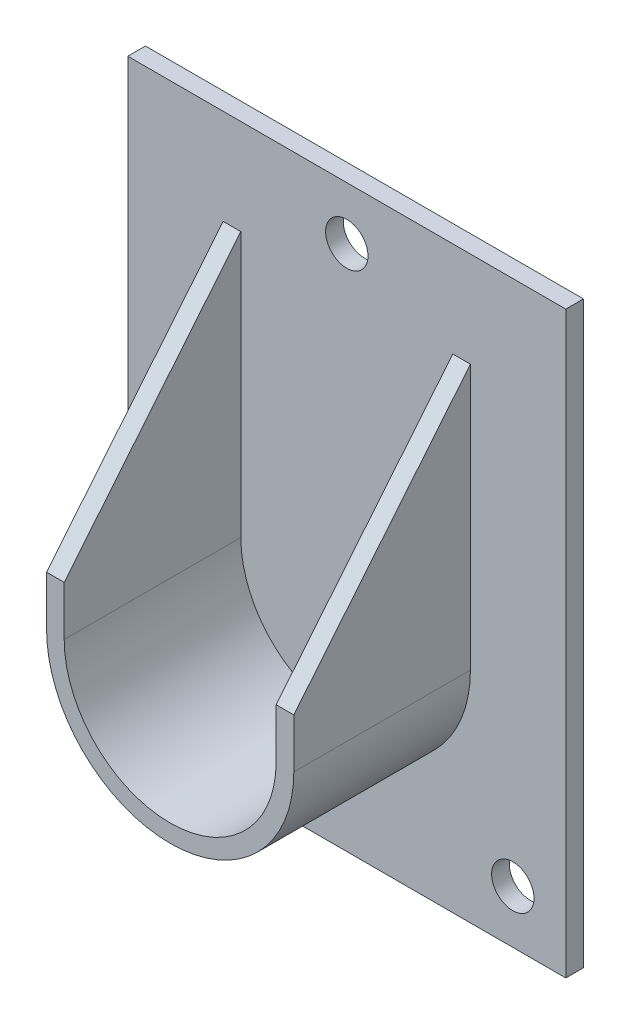
ISO-10303-21;
HEADER;
FILE_DESCRIPTION(('STEP AP214'),'2;1');
FILE_NAME('part.step','',(''),(''),'','','');
FILE_SCHEMA(('AUTOMOTIVE_DESIGN { 1 0 10303 214 1 1 1 1 }'));
ENDSEC;
DATA;
#1=APPLICATION_CONTEXT('core data for automotive mechanical design processes');
#2=APPLICATION_PROTOCOL_DEFINITION('international standard','automotive_design',2000,#1);
#3=PRODUCT_CONTEXT('',#1,'mechanical');
#4=PRODUCT('Part','Part','',(#3));
#5=PRODUCT_RELATED_PRODUCT_CATEGORY('part','',(#4));
#6=PRODUCT_DEFINITION_FORMATION('','',#4);
#7=PRODUCT_DEFINITION_CONTEXT('part definition',#1,'design');
#8=PRODUCT_DEFINITION('design','',#6,#7);
#9=PRODUCT_DEFINITION_SHAPE('','',#8);
#10=(LENGTH_UNIT() NAMED_UNIT(*) SI_UNIT(.MILLI.,.METRE.));
#11=(NAMED_UNIT(*) PLANE_ANGLE_UNIT() SI_UNIT($,.RADIAN.));
#12=(NAMED_UNIT(*) SI_UNIT($,.STERADIAN.) SOLID_ANGLE_UNIT());
#13=UNCERTAINTY_MEASURE_WITH_UNIT(LENGTH_MEASURE(1.E-05),#10,'distance_accuracy_value','');
#14=(GEOMETRIC_REPRESENTATION_CONTEXT(3) GLOBAL_UNCERTAINTY_ASSIGNED_CONTEXT((#13)) GLOBAL_UNIT_ASSIGNED_CONTEXT((#10,
#11,#12)) REPRESENTATION_CONTEXT('',''));
#15=CARTESIAN_POINT('',(0.,0.,0.));
#16=DIRECTION('',(0.,0.,1.));
#17=DIRECTION('',(1.,0.,0.));
#18=AXIS2_PLACEMENT_3D('',#15,#16,#17);
#19=CARTESIAN_POINT('',(30.,0.,55.));
#20=DIRECTION('',(1.,0.,0.));
#21=DIRECTION('',(0.,0.,-1.));
#22=AXIS2_PLACEMENT_3D('',#19,#20,#21);
#23=PLANE('',#22);
#24=DIRECTION('',(0.,-0.773392104960213,0.63392795488542));
#25=VECTOR('',#24,1.);
#26=CARTESIAN_POINT('',(30.,5.62610512779297,61.8638482559074));
#27=LINE('',#26,#25);
#28=CARTESIAN_POINT('',(30.,75.,5.));
#29=VERTEX_POINT('',#28);
#30=CARTESIAN_POINT('',(30.,14.,55.));
#31=VERTEX_POINT('',#30);
#32=EDGE_CURVE('E300',#29,#31,#27,.T.);
#33=ORIENTED_EDGE('',*,*,#32,.F.);
#34=DIRECTION('',(0.,-1.,0.));
#35=VECTOR('',#34,1.);
#36=CARTESIAN_POINT('',(30.,75.,5.));
#37=LINE('',#36,#35);
#38=CARTESIAN_POINT('',(30.,0.,5.));
#39=VERTEX_POINT('',#38);
#40=EDGE_CURVE('E323',#29,#39,#37,.T.);
#41=ORIENTED_EDGE('',*,*,#40,.T.);
#42=DIRECTION('',(0.,0.,-1.));
#43=VECTOR('',#42,1.);
#44=CARTESIAN_POINT('',(30.,0.,55.));
#45=LINE('',#44,#43);
#46=CARTESIAN_POINT('',(30.,0.,55.));
#47=VERTEX_POINT('',#46);
#48=EDGE_CURVE('E309',#47,#39,#45,.T.);
#49=ORIENTED_EDGE('',*,*,#48,.F.);
#50=DIRECTION('',(0.,-1.,0.));
#51=VECTOR('',#50,1.);
#52=CARTESIAN_POINT('',(30.,0.,55.));
#53=LINE('',#52,#51);
#54=EDGE_CURVE('E306',#31,#47,#53,.T.);
#55=ORIENTED_EDGE('',*,*,#54,.F.);
#56=EDGE_LOOP('',(#33,#41,#49,#55));
#57=FACE_BOUND('',#56,.T.);
#58=ADVANCED_FACE('F39',(#57),#23,.F.);
#59=CARTESIAN_POINT('',(35.,0.,55.));
#60=DIRECTION('',(1.,0.,0.));
#61=DIRECTION('',(0.,1.,0.));
#62=AXIS2_PLACEMENT_3D('',#59,#60,#61);
#63=PLANE('',#62);
#64=DIRECTION('',(0.,1.,0.));
#65=VECTOR('',#64,1.);
#66=CARTESIAN_POINT('',(35.,75.,5.));
#67=LINE('',#66,#65);
#68=CARTESIAN_POINT('',(35.,0.,5.));
#69=VERTEX_POINT('',#68);
#70=CARTESIAN_POINT('',(35.,75.,5.));
#71=VERTEX_POINT('',#70);
#72=EDGE_CURVE('E147',#69,#71,#67,.T.);
#73=ORIENTED_EDGE('',*,*,#72,.T.);
#74=DIRECTION('',(0.,-0.773392104960213,0.63392795488542));
#75=VECTOR('',#74,1.);
#76=CARTESIAN_POINT('',(35.,5.62610512779298,61.8638482559074));
#77=LINE('',#76,#75);
#78=CARTESIAN_POINT('',(35.,14.,55.));
#79=VERTEX_POINT('',#78);
#80=EDGE_CURVE('E142',#71,#79,#77,.T.);
#81=ORIENTED_EDGE('',*,*,#80,.T.);
#82=DIRECTION('',(0.,-1.,0.));
#83=VECTOR('',#82,1.);
#84=CARTESIAN_POINT('',(35.,0.,55.));
#85=LINE('',#84,#83);
#86=CARTESIAN_POINT('',(35.,0.,55.));
#87=VERTEX_POINT('',#86);
#88=EDGE_CURVE('E308',#79,#87,#85,.T.);
#89=ORIENTED_EDGE('',*,*,#88,.T.);
#90=DIRECTION('',(0.,0.,-1.));
#91=VECTOR('',#90,1.);
#92=CARTESIAN_POINT('',(35.,0.,55.));
#93=LINE('',#92,#91);
#94=EDGE_CURVE('E311',#87,#69,#93,.T.);
#95=ORIENTED_EDGE('',*,*,#94,.T.);
#96=EDGE_LOOP('',(#73,#81,#89,#95));
#97=FACE_BOUND('',#96,.T.);
#98=ADVANCED_FACE('F252',(#97),#63,.T.);
#99=CARTESIAN_POINT('',(-35.,0.,55.));
#100=DIRECTION('',(1.,0.,0.));
#101=DIRECTION('',(0.,1.,0.));
#102=AXIS2_PLACEMENT_3D('',#99,#100,#101);
#103=PLANE('',#102);
#104=DIRECTION('',(0.,-0.773392104960213,0.63392795488542));
#105=VECTOR('',#104,1.);
#106=CARTESIAN_POINT('',(-35.,5.62610512779296,61.8638482559074));
#107=LINE('',#106,#105);
#108=CARTESIAN_POINT('',(-35.,75.,5.));
#109=VERTEX_POINT('',#108);
#110=CARTESIAN_POINT('',(-35.,14.,55.));
#111=VERTEX_POINT('',#110);
#112=EDGE_CURVE('E126',#109,#111,#107,.T.);
#113=ORIENTED_EDGE('',*,*,#112,.F.);
#114=DIRECTION('',(0.,-1.,0.));
#115=VECTOR('',#114,1.);
#116=CARTESIAN_POINT('',(-35.,75.,5.));
#117=LINE('',#116,#115);
#118=CARTESIAN_POINT('',(-35.,0.,5.));
#119=VERTEX_POINT('',#118);
#120=EDGE_CURVE('E135',#109,#119,#117,.T.);
#121=ORIENTED_EDGE('',*,*,#120,.T.);
#122=DIRECTION('',(0.,0.,-1.));
#123=VECTOR('',#122,1.);
#124=CARTESIAN_POINT('',(-35.,0.,55.));
#125=LINE('',#124,#123);
#126=CARTESIAN_POINT('',(-35.,0.,55.));
#127=VERTEX_POINT('',#126);
#128=EDGE_CURVE('E316',#127,#119,#125,.T.);
#129=ORIENTED_EDGE('',*,*,#128,.F.);
#130=DIRECTION('',(0.,-1.,0.));
#131=VECTOR('',#130,1.);
#132=CARTESIAN_POINT('',(-35.,0.,55.));
#133=LINE('',#132,#131);
#134=EDGE_CURVE('E143',#111,#127,#133,.T.);
#135=ORIENTED_EDGE('',*,*,#134,.F.);
#136=EDGE_LOOP('',(#113,#121,#129,#135));
#137=FACE_BOUND('',#136,.T.);
#138=ADVANCED_FACE('F139',(#137),#103,.F.);
#139=CARTESIAN_POINT('',(-30.,0.,55.));
#140=DIRECTION('',(1.,0.,0.));
#141=DIRECTION('',(0.,0.,-1.));
#142=AXIS2_PLACEMENT_3D('',#139,#140,#141);
#143=PLANE('',#142);
#144=DIRECTION('',(0.,1.,0.));
#145=VECTOR('',#144,1.);
#146=CARTESIAN_POINT('',(-30.,75.,5.));
#147=LINE('',#146,#145);
#148=CARTESIAN_POINT('',(-30.,0.,5.));
#149=VERTEX_POINT('',#148);
#150=CARTESIAN_POINT('',(-30.,75.,5.));
#151=VERTEX_POINT('',#150);
#152=EDGE_CURVE('E134',#149,#151,#147,.T.);
#153=ORIENTED_EDGE('',*,*,#152,.T.);
#154=DIRECTION('',(0.,-0.773392104960213,0.63392795488542));
#155=VECTOR('',#154,1.);
#156=CARTESIAN_POINT('',(-30.,5.62610512779296,61.8638482559074));
#157=LINE('',#156,#155);
#158=CARTESIAN_POINT('',(-30.,14.,55.));
#159=VERTEX_POINT('',#158);
#160=EDGE_CURVE('E11',#151,#159,#157,.T.);
#161=ORIENTED_EDGE('',*,*,#160,.T.);
#162=DIRECTION('',(0.,-1.,0.));
#163=VECTOR('',#162,1.);
#164=CARTESIAN_POINT('',(-30.,0.,55.));
#165=LINE('',#164,#163);
#166=CARTESIAN_POINT('',(-30.,0.,55.));
#167=VERTEX_POINT('',#166);
#168=EDGE_CURVE('E291',#159,#167,#165,.T.);
#169=ORIENTED_EDGE('',*,*,#168,.T.);
#170=DIRECTION('',(0.,0.,-1.));
#171=VECTOR('',#170,1.);
#172=CARTESIAN_POINT('',(-30.,0.,55.));
#173=LINE('',#172,#171);
#174=EDGE_CURVE('E318',#167,#149,#173,.T.);
#175=ORIENTED_EDGE('',*,*,#174,.T.);
#176=EDGE_LOOP('',(#153,#161,#169,#175));
#177=FACE_BOUND('',#176,.T.);
#178=ADVANCED_FACE('F225',(#177),#143,.T.);
#179=CARTESIAN_POINT('',(0.,0.,5.));
#180=DIRECTION('',(0.,0.,1.));
#181=DIRECTION('',(1.,0.,0.));
#182=AXIS2_PLACEMENT_3D('',#179,#180,#181);
#183=PLANE('',#182);
#184=DIRECTION('',(-1.,0.,0.));
#185=VECTOR('',#184,1.);
#186=CARTESIAN_POINT('',(35.,75.,5.));
#187=LINE('',#186,#185);
#188=EDGE_CURVE('E321',#71,#29,#187,.T.);
#189=ORIENTED_EDGE('',*,*,#188,.F.);
#190=ORIENTED_EDGE('',*,*,#72,.F.);
#191=CARTESIAN_POINT('',(0.,0.,5.));
#192=DIRECTION('',(0.,0.,1.));
#193=DIRECTION('',(1.,0.,0.));
#194=AXIS2_PLACEMENT_3D('',#191,#192,#193);
#195=CIRCLE('',#194,35.);
#196=EDGE_CURVE('E146',#119,#69,#195,.T.);
#197=ORIENTED_EDGE('',*,*,#196,.F.);
#198=ORIENTED_EDGE('',*,*,#120,.F.);
#199=DIRECTION('',(-1.,0.,0.));
#200=VECTOR('',#199,1.);
#201=CARTESIAN_POINT('',(-30.,75.,5.));
#202=LINE('',#201,#200);
#203=EDGE_CURVE('E123',#151,#109,#202,.T.);
#204=ORIENTED_EDGE('',*,*,#203,.F.);
#205=ORIENTED_EDGE('',*,*,#152,.F.);
#206=CARTESIAN_POINT('',(0.,0.,5.));
#207=DIRECTION('',(0.,0.,-1.));
#208=DIRECTION('',(1.,0.,0.));
#209=AXIS2_PLACEMENT_3D('',#206,#207,#208);
#210=CIRCLE('',#209,30.);
#211=EDGE_CURVE('E326',#39,#149,#210,.T.);
#212=ORIENTED_EDGE('',*,*,#211,.F.);
#213=ORIENTED_EDGE('',*,*,#40,.F.);
#214=EDGE_LOOP('',(#189,#190,#197,#198,#204,#205,#212,#213));
#215=FACE_BOUND('',#214,.T.);
#216=DIRECTION('',(0.,1.,0.));
#217=VECTOR('',#216,1.);
#218=CARTESIAN_POINT('',(62.,102.,5.));
#219=LINE('',#218,#217);
#220=CARTESIAN_POINT('',(62.,-62.,5.));
#221=VERTEX_POINT('',#220);
#222=CARTESIAN_POINT('',(62.,102.,5.));
#223=VERTEX_POINT('',#222);
#224=EDGE_CURVE('E178',#221,#223,#219,.T.);
#225=ORIENTED_EDGE('',*,*,#224,.T.);
#226=DIRECTION('',(-1.,0.,0.));
#227=VECTOR('',#226,1.);
#228=CARTESIAN_POINT('',(-62.,102.,5.));
#229=LINE('',#228,#227);
#230=CARTESIAN_POINT('',(-62.,102.,5.));
#231=VERTEX_POINT('',#230);
#232=EDGE_CURVE('E185',#223,#231,#229,.T.);
#233=ORIENTED_EDGE('',*,*,#232,.T.);
#234=DIRECTION('',(0.,-1.,0.));
#235=VECTOR('',#234,1.);
#236=CARTESIAN_POINT('',(-62.,102.,5.));
#237=LINE('',#236,#235);
#238=CARTESIAN_POINT('',(-62.,-62.,5.));
#239=VERTEX_POINT('',#238);
#240=EDGE_CURVE('E173',#231,#239,#237,.T.);
#241=ORIENTED_EDGE('',*,*,#240,.T.);
#242=DIRECTION('',(1.,0.,0.));
#243=VECTOR('',#242,1.);
#244=CARTESIAN_POINT('',(-62.,-62.,5.));
#245=LINE('',#244,#243);
#246=EDGE_CURVE('E180',#239,#221,#245,.T.);
#247=ORIENTED_EDGE('',*,*,#246,.T.);
#248=EDGE_LOOP('',(#225,#233,#241,#247));
#249=FACE_BOUND('',#248,.T.);
#250=CARTESIAN_POINT('',(0.,87.,5.));
#251=DIRECTION('',(0.,0.,1.));
#252=DIRECTION('',(1.,0.,0.));
#253=AXIS2_PLACEMENT_3D('',#250,#251,#252);
#254=CIRCLE('',#253,6.00000000000001);
#255=CARTESIAN_POINT('',(6.00000000000001,87.,5.));
#256=VERTEX_POINT('',#255);
#257=EDGE_CURVE('E166',#256,#256,#254,.T.);
#258=ORIENTED_EDGE('',*,*,#257,.F.);
#259=EDGE_LOOP('',(#258));
#260=FACE_BOUND('',#259,.T.);
#261=CARTESIAN_POINT('',(-47.,-47.,5.));
#262=DIRECTION('',(0.,0.,1.));
#263=DIRECTION('',(-1.,0.,0.));
#264=AXIS2_PLACEMENT_3D('',#261,#262,#263);
#265=CIRCLE('',#264,6.);
#266=CARTESIAN_POINT('',(-53.,-47.,5.));
#267=VERTEX_POINT('',#266);
#268=EDGE_CURVE('E160',#267,#267,#265,.T.);
#269=ORIENTED_EDGE('',*,*,#268,.F.);
#270=EDGE_LOOP('',(#269));
#271=FACE_BOUND('',#270,.T.);
#272=CARTESIAN_POINT('',(47.,-47.,5.));
#273=DIRECTION('',(0.,0.,1.));
#274=DIRECTION('',(1.,0.,0.));
#275=AXIS2_PLACEMENT_3D('',#272,#273,#274);
#276=CIRCLE('',#275,6.);
#277=CARTESIAN_POINT('',(53.,-47.,5.));
#278=VERTEX_POINT('',#277);
#279=EDGE_CURVE('E162',#278,#278,#276,.T.);
#280=ORIENTED_EDGE('',*,*,#279,.F.);
#281=EDGE_LOOP('',(#280));
#282=FACE_BOUND('',#281,.T.);
#283=ADVANCED_FACE('F144',(#215,#249,#260,#271,#282),#183,.T.);
#284=CARTESIAN_POINT('',(0.,0.,0.));
#285=DIRECTION('',(0.,0.,1.));
#286=DIRECTION('',(1.,0.,0.));
#287=AXIS2_PLACEMENT_3D('',#284,#285,#286);
#288=PLANE('',#287);
#289=CARTESIAN_POINT('',(-47.,-47.,0.));
#290=DIRECTION('',(0.,0.,1.));
#291=DIRECTION('',(-1.,0.,0.));
#292=AXIS2_PLACEMENT_3D('',#289,#290,#291);
#293=CIRCLE('',#292,6.);
#294=CARTESIAN_POINT('',(-53.,-47.,0.));
#295=VERTEX_POINT('',#294);
#296=EDGE_CURVE('E156',#295,#295,#293,.T.);
#297=ORIENTED_EDGE('',*,*,#296,.T.);
#298=EDGE_LOOP('',(#297));
#299=FACE_BOUND('',#298,.T.);
#300=CARTESIAN_POINT('',(47.,-47.,0.));
#301=DIRECTION('',(0.,0.,1.));
#302=DIRECTION('',(1.,0.,0.));
#303=AXIS2_PLACEMENT_3D('',#300,#301,#302);
#304=CIRCLE('',#303,6.);
#305=CARTESIAN_POINT('',(53.,-47.,0.));
#306=VERTEX_POINT('',#305);
#307=EDGE_CURVE('E159',#306,#306,#304,.T.);
#308=ORIENTED_EDGE('',*,*,#307,.T.);
#309=EDGE_LOOP('',(#308));
#310=FACE_BOUND('',#309,.T.);
#311=CARTESIAN_POINT('',(0.,87.,0.));
#312=DIRECTION('',(0.,0.,1.));
#313=DIRECTION('',(1.,0.,0.));
#314=AXIS2_PLACEMENT_3D('',#311,#312,#313);
#315=CIRCLE('',#314,6.00000000000001);
#316=CARTESIAN_POINT('',(6.00000000000001,87.,0.));
#317=VERTEX_POINT('',#316);
#318=EDGE_CURVE('E167',#317,#317,#315,.T.);
#319=ORIENTED_EDGE('',*,*,#318,.T.);
#320=EDGE_LOOP('',(#319));
#321=FACE_BOUND('',#320,.T.);
#322=DIRECTION('',(0.,-1.,0.));
#323=VECTOR('',#322,1.);
#324=CARTESIAN_POINT('',(-62.,102.,0.));
#325=LINE('',#324,#323);
#326=CARTESIAN_POINT('',(-62.,102.,0.));
#327=VERTEX_POINT('',#326);
#328=CARTESIAN_POINT('',(-62.,-62.,0.));
#329=VERTEX_POINT('',#328);
#330=EDGE_CURVE('E175',#327,#329,#325,.T.);
#331=ORIENTED_EDGE('',*,*,#330,.F.);
#332=DIRECTION('',(-1.,0.,0.));
#333=VECTOR('',#332,1.);
#334=CARTESIAN_POINT('',(-62.,102.,0.));
#335=LINE('',#334,#333);
#336=CARTESIAN_POINT('',(62.,102.,0.));
#337=VERTEX_POINT('',#336);
#338=EDGE_CURVE('E179',#337,#327,#335,.T.);
#339=ORIENTED_EDGE('',*,*,#338,.F.);
#340=DIRECTION('',(0.,1.,0.));
#341=VECTOR('',#340,1.);
#342=CARTESIAN_POINT('',(62.,102.,0.));
#343=LINE('',#342,#341);
#344=CARTESIAN_POINT('',(62.,-62.,0.));
#345=VERTEX_POINT('',#344);
#346=EDGE_CURVE('E186',#345,#337,#343,.T.);
#347=ORIENTED_EDGE('',*,*,#346,.F.);
#348=DIRECTION('',(1.,0.,0.));
#349=VECTOR('',#348,1.);
#350=CARTESIAN_POINT('',(-62.,-62.,0.));
#351=LINE('',#350,#349);
#352=EDGE_CURVE('E190',#329,#345,#351,.T.);
#353=ORIENTED_EDGE('',*,*,#352,.F.);
#354=EDGE_LOOP('',(#331,#339,#347,#353));
#355=FACE_BOUND('',#354,.T.);
#356=ADVANCED_FACE('F211',(#299,#310,#321,#355),#288,.F.);
#357=CARTESIAN_POINT('',(-62.,102.,5.));
#358=DIRECTION('',(1.,0.,0.));
#359=DIRECTION('',(0.,1.,0.));
#360=AXIS2_PLACEMENT_3D('',#357,#358,#359);
#361=PLANE('',#360);
#362=ORIENTED_EDGE('',*,*,#330,.T.);
#363=DIRECTION('',(0.,0.,-1.));
#364=VECTOR('',#363,1.);
#365=CARTESIAN_POINT('',(-62.,-62.,5.));
#366=LINE('',#365,#364);
#367=EDGE_CURVE('E50',#239,#329,#366,.T.);
#368=ORIENTED_EDGE('',*,*,#367,.F.);
#369=ORIENTED_EDGE('',*,*,#240,.F.);
#370=DIRECTION('',(0.,0.,-1.));
#371=VECTOR('',#370,1.);
#372=CARTESIAN_POINT('',(-62.,102.,5.));
#373=LINE('',#372,#371);
#374=EDGE_CURVE('E184',#231,#327,#373,.T.);
#375=ORIENTED_EDGE('',*,*,#374,.T.);
#376=EDGE_LOOP('',(#362,#368,#369,#375));
#377=FACE_BOUND('',#376,.T.);
#378=ADVANCED_FACE('F41',(#377),#361,.F.);
#379=CARTESIAN_POINT('',(-62.,-62.,5.));
#380=DIRECTION('',(0.,1.,0.));
#381=DIRECTION('',(-1.,0.,0.));
#382=AXIS2_PLACEMENT_3D('',#379,#380,#381);
#383=PLANE('',#382);
#384=ORIENTED_EDGE('',*,*,#352,.T.);
#385=DIRECTION('',(0.,0.,-1.));
#386=VECTOR('',#385,1.);
#387=CARTESIAN_POINT('',(62.,-62.,5.));
#388=LINE('',#387,#386);
#389=EDGE_CURVE('E197',#221,#345,#388,.T.);
#390=ORIENTED_EDGE('',*,*,#389,.F.);
#391=ORIENTED_EDGE('',*,*,#246,.F.);
#392=ORIENTED_EDGE('',*,*,#367,.T.);
#393=EDGE_LOOP('',(#384,#390,#391,#392));
#394=FACE_BOUND('',#393,.T.);
#395=ADVANCED_FACE('F201',(#394),#383,.F.);
#396=CARTESIAN_POINT('',(62.,102.,5.));
#397=DIRECTION('',(-1.,0.,0.));
#398=DIRECTION('',(0.,-1.,0.));
#399=AXIS2_PLACEMENT_3D('',#396,#397,#398);
#400=PLANE('',#399);
#401=ORIENTED_EDGE('',*,*,#346,.T.);
#402=DIRECTION('',(0.,0.,-1.));
#403=VECTOR('',#402,1.);
#404=CARTESIAN_POINT('',(62.,102.,5.));
#405=LINE('',#404,#403);
#406=EDGE_CURVE('E191',#223,#337,#405,.T.);
#407=ORIENTED_EDGE('',*,*,#406,.F.);
#408=ORIENTED_EDGE('',*,*,#224,.F.);
#409=ORIENTED_EDGE('',*,*,#389,.T.);
#410=EDGE_LOOP('',(#401,#407,#408,#409));
#411=FACE_BOUND('',#410,.T.);
#412=ADVANCED_FACE('F214',(#411),#400,.F.);
#413=CARTESIAN_POINT('',(-62.,102.,5.));
#414=DIRECTION('',(0.,-1.,0.));
#415=DIRECTION('',(1.,0.,0.));
#416=AXIS2_PLACEMENT_3D('',#413,#414,#415);
#417=PLANE('',#416);
#418=ORIENTED_EDGE('',*,*,#338,.T.);
#419=ORIENTED_EDGE('',*,*,#374,.F.);
#420=ORIENTED_EDGE('',*,*,#232,.F.);
#421=ORIENTED_EDGE('',*,*,#406,.T.);
#422=EDGE_LOOP('',(#418,#419,#420,#421));
#423=FACE_BOUND('',#422,.T.);
#424=ADVANCED_FACE('F218',(#423),#417,.F.);
#425=CARTESIAN_POINT('',(0.,87.,5.));
#426=DIRECTION('',(0.,0.,-1.));
#427=DIRECTION('',(-1.,0.,0.));
#428=AXIS2_PLACEMENT_3D('',#425,#426,#427);
#429=CYLINDRICAL_SURFACE('',#428,6.00000000000001);
#430=ORIENTED_EDGE('',*,*,#257,.T.);
#431=EDGE_LOOP('',(#430));
#432=FACE_BOUND('',#431,.T.);
#433=ORIENTED_EDGE('',*,*,#318,.F.);
#434=EDGE_LOOP('',(#433));
#435=FACE_BOUND('',#434,.T.);
#436=ADVANCED_FACE('F231',(#432,#435),#429,.F.);
#437=CARTESIAN_POINT('',(47.,-47.,5.));
#438=DIRECTION('',(0.,0.,-1.));
#439=DIRECTION('',(-1.,0.,0.));
#440=AXIS2_PLACEMENT_3D('',#437,#438,#439);
#441=CYLINDRICAL_SURFACE('',#440,6.);
#442=ORIENTED_EDGE('',*,*,#279,.T.);
#443=EDGE_LOOP('',(#442));
#444=FACE_BOUND('',#443,.T.);
#445=ORIENTED_EDGE('',*,*,#307,.F.);
#446=EDGE_LOOP('',(#445));
#447=FACE_BOUND('',#446,.T.);
#448=ADVANCED_FACE('F228',(#444,#447),#441,.F.);
#449=CARTESIAN_POINT('',(-47.,-47.,5.));
#450=DIRECTION('',(0.,0.,-1.));
#451=DIRECTION('',(-1.,0.,0.));
#452=AXIS2_PLACEMENT_3D('',#449,#450,#451);
#453=CYLINDRICAL_SURFACE('',#452,6.);
#454=ORIENTED_EDGE('',*,*,#268,.T.);
#455=EDGE_LOOP('',(#454));
#456=FACE_BOUND('',#455,.T.);
#457=ORIENTED_EDGE('',*,*,#296,.F.);
#458=EDGE_LOOP('',(#457));
#459=FACE_BOUND('',#458,.T.);
#460=ADVANCED_FACE('F234',(#456,#459),#453,.F.);
#461=CARTESIAN_POINT('',(0.,0.,55.));
#462=DIRECTION('',(0.,0.,1.));
#463=DIRECTION('',(1.,0.,0.));
#464=AXIS2_PLACEMENT_3D('',#461,#462,#463);
#465=PLANE('',#464);
#466=DIRECTION('',(1.,0.,0.));
#467=VECTOR('',#466,1.);
#468=CARTESIAN_POINT('',(-62.0000000000001,14.,55.));
#469=LINE('',#468,#467);
#470=EDGE_CURVE('E65',#111,#159,#469,.T.);
#471=ORIENTED_EDGE('',*,*,#470,.F.);
#472=ORIENTED_EDGE('',*,*,#134,.T.);
#473=CARTESIAN_POINT('',(0.,0.,55.));
#474=DIRECTION('',(0.,0.,1.));
#475=DIRECTION('',(1.,0.,0.));
#476=AXIS2_PLACEMENT_3D('',#473,#474,#475);
#477=CIRCLE('',#476,35.);
#478=EDGE_CURVE('E301',#127,#87,#477,.T.);
#479=ORIENTED_EDGE('',*,*,#478,.T.);
#480=ORIENTED_EDGE('',*,*,#88,.F.);
#481=EDGE_CURVE('E53',#31,#79,#469,.T.);
#482=ORIENTED_EDGE('',*,*,#481,.F.);
#483=ORIENTED_EDGE('',*,*,#54,.T.);
#484=CARTESIAN_POINT('',(0.,0.,55.));
#485=DIRECTION('',(0.,0.,1.));
#486=DIRECTION('',(1.,0.,0.));
#487=AXIS2_PLACEMENT_3D('',#484,#485,#486);
#488=CIRCLE('',#487,30.);
#489=EDGE_CURVE('E296',#167,#47,#488,.T.);
#490=ORIENTED_EDGE('',*,*,#489,.F.);
#491=ORIENTED_EDGE('',*,*,#168,.F.);
#492=EDGE_LOOP('',(#471,#472,#479,#480,#482,#483,#490,#491));
#493=FACE_BOUND('',#492,.T.);
#494=ADVANCED_FACE('F263',(#493),#465,.T.);
#495=CARTESIAN_POINT('',(0.,0.,55.));
#496=DIRECTION('',(0.,0.,-1.));
#497=DIRECTION('',(-1.,0.,0.));
#498=AXIS2_PLACEMENT_3D('',#495,#496,#497);
#499=CYLINDRICAL_SURFACE('',#498,35.);
#500=ORIENTED_EDGE('',*,*,#196,.T.);
#501=ORIENTED_EDGE('',*,*,#94,.F.);
#502=ORIENTED_EDGE('',*,*,#478,.F.);
#503=ORIENTED_EDGE('',*,*,#128,.T.);
#504=EDGE_LOOP('',(#500,#501,#502,#503));
#505=FACE_BOUND('',#504,.T.);
#506=ADVANCED_FACE('F266',(#505),#499,.T.);
#507=CARTESIAN_POINT('',(0.,0.,55.));
#508=DIRECTION('',(0.,0.,-1.));
#509=DIRECTION('',(-1.,0.,0.));
#510=AXIS2_PLACEMENT_3D('',#507,#508,#509);
#511=CYLINDRICAL_SURFACE('',#510,30.);
#512=ORIENTED_EDGE('',*,*,#48,.T.);
#513=ORIENTED_EDGE('',*,*,#211,.T.);
#514=ORIENTED_EDGE('',*,*,#174,.F.);
#515=ORIENTED_EDGE('',*,*,#489,.T.);
#516=EDGE_LOOP('',(#512,#513,#514,#515));
#517=FACE_BOUND('',#516,.T.);
#518=ADVANCED_FACE('F267',(#517),#511,.F.);
#519=CARTESIAN_POINT('',(-62.0000000000001,32.5912232760006,39.7612923967208));
#520=DIRECTION('',(0.,0.63392795488542,0.773392104960213));
#521=DIRECTION('',(0.,-0.773392104960213,0.63392795488542));
#522=AXIS2_PLACEMENT_3D('',#519,#520,#521);
#523=PLANE('',#522);
#524=ORIENTED_EDGE('',*,*,#112,.T.);
#525=ORIENTED_EDGE('',*,*,#470,.T.);
#526=ORIENTED_EDGE('',*,*,#160,.F.);
#527=ORIENTED_EDGE('',*,*,#203,.T.);
#528=EDGE_LOOP('',(#524,#525,#526,#527));
#529=FACE_BOUND('',#528,.T.);
#530=ADVANCED_FACE('F130',(#529),#523,.T.);
#531=ORIENTED_EDGE('',*,*,#32,.T.);
#532=ORIENTED_EDGE('',*,*,#481,.T.);
#533=ORIENTED_EDGE('',*,*,#80,.F.);
#534=ORIENTED_EDGE('',*,*,#188,.T.);
#535=EDGE_LOOP('',(#531,#532,#533,#534));
#536=FACE_BOUND('',#535,.T.);
#537=ADVANCED_FACE('F333',(#536),#523,.T.);
#538=CLOSED_SHELL('',(#58,#98,#138,#178,#283,#356,#378,#395,#412,#424,#436,#448,#460,#494,#506,
#518,#530,#537));
#539=MANIFOLD_SOLID_BREP('B2',#538);
#540=ADVANCED_BREP_SHAPE_REPRESENTATION('',(#18,#539),#14);
#541=SHAPE_DEFINITION_REPRESENTATION(#9,#540);
ENDSEC;
END-ISO-10303-21;
